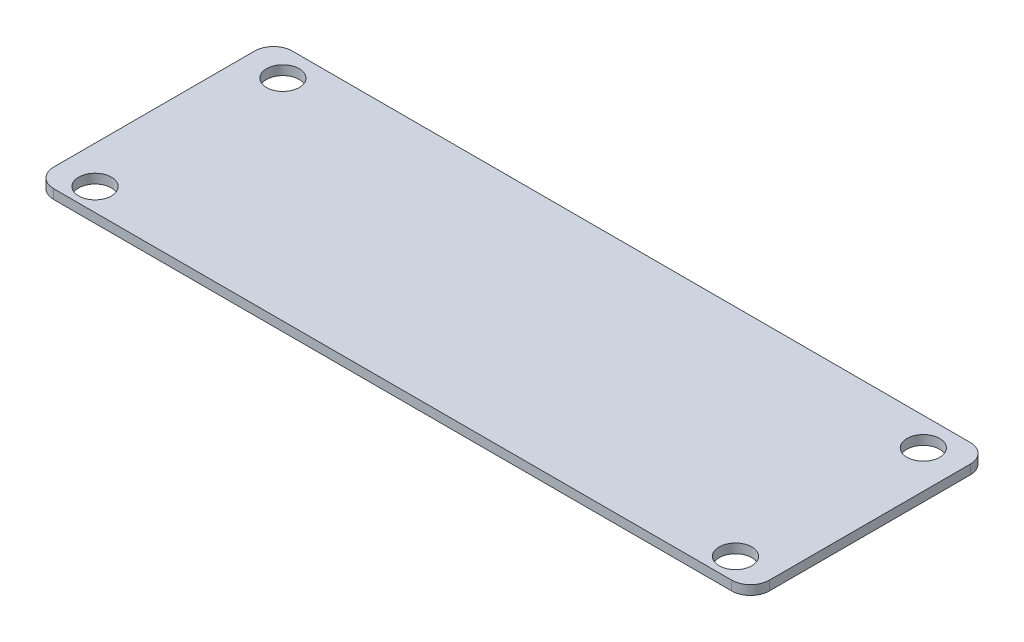
ISO-10303-21;
HEADER;
FILE_DESCRIPTION(('STEP AP214'),'2;1');
FILE_NAME('part.step','',(''),(''),'','','');
FILE_SCHEMA(('AUTOMOTIVE_DESIGN { 1 0 10303 214 1 1 1 1 }'));
ENDSEC;
DATA;
#1=APPLICATION_CONTEXT('core data for automotive mechanical design processes');
#2=APPLICATION_PROTOCOL_DEFINITION('international standard','automotive_design',2000,#1);
#3=PRODUCT_CONTEXT('',#1,'mechanical');
#4=PRODUCT('Part','Part','',(#3));
#5=PRODUCT_RELATED_PRODUCT_CATEGORY('part','',(#4));
#6=PRODUCT_DEFINITION_FORMATION('','',#4);
#7=PRODUCT_DEFINITION_CONTEXT('part definition',#1,'design');
#8=PRODUCT_DEFINITION('design','',#6,#7);
#9=PRODUCT_DEFINITION_SHAPE('','',#8);
#10=(LENGTH_UNIT() NAMED_UNIT(*) SI_UNIT(.MILLI.,.METRE.));
#11=(NAMED_UNIT(*) PLANE_ANGLE_UNIT() SI_UNIT($,.RADIAN.));
#12=(NAMED_UNIT(*) SI_UNIT($,.STERADIAN.) SOLID_ANGLE_UNIT());
#13=UNCERTAINTY_MEASURE_WITH_UNIT(LENGTH_MEASURE(1.E-05),#10,'distance_accuracy_value','');
#14=(GEOMETRIC_REPRESENTATION_CONTEXT(3) GLOBAL_UNCERTAINTY_ASSIGNED_CONTEXT((#13)) GLOBAL_UNIT_ASSIGNED_CONTEXT((#10,
#11,#12)) REPRESENTATION_CONTEXT('',''));
#15=CARTESIAN_POINT('',(0.,0.,0.));
#16=DIRECTION('',(0.,0.,1.));
#17=DIRECTION('',(1.,0.,0.));
#18=AXIS2_PLACEMENT_3D('',#15,#16,#17);
#19=CARTESIAN_POINT('',(36.1,1.,-10.7));
#20=DIRECTION('',(0.,-1.,0.));
#21=DIRECTION('',(0.,0.,-1.));
#22=AXIS2_PLACEMENT_3D('',#19,#20,#21);
#23=PLANE('',#22);
#24=CARTESIAN_POINT('',(36.1,1.,-10.7));
#25=DIRECTION('',(0.,1.,0.));
#26=DIRECTION('',(0.,0.,-1.));
#27=AXIS2_PLACEMENT_3D('',#24,#25,#26);
#28=CIRCLE('',#27,2.);
#29=CARTESIAN_POINT('',(38.1,1.,-10.7));
#30=VERTEX_POINT('',#29);
#31=CARTESIAN_POINT('',(36.1,1.,-12.7));
#32=VERTEX_POINT('',#31);
#33=EDGE_CURVE('E150',#30,#32,#28,.T.);
#34=ORIENTED_EDGE('',*,*,#33,.T.);
#35=DIRECTION('',(-1.,0.,0.));
#36=VECTOR('',#35,1.);
#37=CARTESIAN_POINT('',(-36.1,1.,-12.7));
#38=LINE('',#37,#36);
#39=CARTESIAN_POINT('',(-36.1,1.,-12.7));
#40=VERTEX_POINT('',#39);
#41=EDGE_CURVE('E98',#32,#40,#38,.T.);
#42=ORIENTED_EDGE('',*,*,#41,.T.);
#43=CARTESIAN_POINT('',(-36.1,1.,-10.7));
#44=DIRECTION('',(0.,1.,0.));
#45=DIRECTION('',(0.,0.,-1.));
#46=AXIS2_PLACEMENT_3D('',#43,#44,#45);
#47=CIRCLE('',#46,2.);
#48=CARTESIAN_POINT('',(-38.1,1.,-10.7));
#49=VERTEX_POINT('',#48);
#50=EDGE_CURVE('E165',#40,#49,#47,.T.);
#51=ORIENTED_EDGE('',*,*,#50,.T.);
#52=DIRECTION('',(0.,0.,1.));
#53=VECTOR('',#52,1.);
#54=CARTESIAN_POINT('',(-38.1,1.,10.7));
#55=LINE('',#54,#53);
#56=CARTESIAN_POINT('',(-38.1,1.,10.7));
#57=VERTEX_POINT('',#56);
#58=EDGE_CURVE('E178',#49,#57,#55,.T.);
#59=ORIENTED_EDGE('',*,*,#58,.T.);
#60=CARTESIAN_POINT('',(-36.1,1.,10.7));
#61=DIRECTION('',(0.,1.,0.));
#62=DIRECTION('',(0.,0.,-1.));
#63=AXIS2_PLACEMENT_3D('',#60,#61,#62);
#64=CIRCLE('',#63,2.);
#65=CARTESIAN_POINT('',(-36.1,1.,12.7));
#66=VERTEX_POINT('',#65);
#67=EDGE_CURVE('E117',#57,#66,#64,.T.);
#68=ORIENTED_EDGE('',*,*,#67,.T.);
#69=DIRECTION('',(1.,0.,0.));
#70=VECTOR('',#69,1.);
#71=CARTESIAN_POINT('',(-36.1,1.,12.7));
#72=LINE('',#71,#70);
#73=CARTESIAN_POINT('',(36.1,1.,12.7));
#74=VERTEX_POINT('',#73);
#75=EDGE_CURVE('E111',#66,#74,#72,.T.);
#76=ORIENTED_EDGE('',*,*,#75,.T.);
#77=CARTESIAN_POINT('',(36.1,1.,10.7));
#78=DIRECTION('',(0.,1.,0.));
#79=DIRECTION('',(0.,0.,1.));
#80=AXIS2_PLACEMENT_3D('',#77,#78,#79);
#81=CIRCLE('',#80,2.);
#82=CARTESIAN_POINT('',(38.1,1.,10.7));
#83=VERTEX_POINT('',#82);
#84=EDGE_CURVE('E115',#74,#83,#81,.T.);
#85=ORIENTED_EDGE('',*,*,#84,.T.);
#86=DIRECTION('',(0.,0.,-1.));
#87=VECTOR('',#86,1.);
#88=CARTESIAN_POINT('',(38.1,1.,10.7));
#89=LINE('',#88,#87);
#90=EDGE_CURVE('E55',#83,#30,#89,.T.);
#91=ORIENTED_EDGE('',*,*,#90,.T.);
#92=EDGE_LOOP('',(#34,#42,#51,#59,#68,#76,#85,#91));
#93=FACE_BOUND('',#92,.T.);
#94=CARTESIAN_POINT('',(-34.1,1.,-9.7));
#95=DIRECTION('',(0.,1.,0.));
#96=DIRECTION('',(0.,0.,1.));
#97=AXIS2_PLACEMENT_3D('',#94,#95,#96);
#98=CIRCLE('',#97,1.7399);
#99=CARTESIAN_POINT('',(-34.1,1.,-7.9601));
#100=VERTEX_POINT('',#99);
#101=EDGE_CURVE('E139',#100,#100,#98,.T.);
#102=ORIENTED_EDGE('',*,*,#101,.F.);
#103=EDGE_LOOP('',(#102));
#104=FACE_BOUND('',#103,.T.);
#105=CARTESIAN_POINT('',(-34.1,1.,10.3));
#106=DIRECTION('',(0.,1.,0.));
#107=DIRECTION('',(0.,0.,1.));
#108=AXIS2_PLACEMENT_3D('',#105,#106,#107);
#109=CIRCLE('',#108,1.7399);
#110=CARTESIAN_POINT('',(-34.1,1.,12.0399));
#111=VERTEX_POINT('',#110);
#112=EDGE_CURVE('E187',#111,#111,#109,.T.);
#113=ORIENTED_EDGE('',*,*,#112,.F.);
#114=EDGE_LOOP('',(#113));
#115=FACE_BOUND('',#114,.T.);
#116=CARTESIAN_POINT('',(34.1,1.,10.3));
#117=DIRECTION('',(0.,1.,0.));
#118=DIRECTION('',(0.,0.,-1.));
#119=AXIS2_PLACEMENT_3D('',#116,#117,#118);
#120=CIRCLE('',#119,1.7399);
#121=CARTESIAN_POINT('',(34.1,1.,8.56009999999999));
#122=VERTEX_POINT('',#121);
#123=EDGE_CURVE('E193',#122,#122,#120,.T.);
#124=ORIENTED_EDGE('',*,*,#123,.F.);
#125=EDGE_LOOP('',(#124));
#126=FACE_BOUND('',#125,.T.);
#127=CARTESIAN_POINT('',(34.1,1.,-9.7));
#128=DIRECTION('',(0.,1.,0.));
#129=DIRECTION('',(0.,0.,-1.));
#130=AXIS2_PLACEMENT_3D('',#127,#128,#129);
#131=CIRCLE('',#130,1.7399);
#132=CARTESIAN_POINT('',(34.1,1.,-11.4399));
#133=VERTEX_POINT('',#132);
#134=EDGE_CURVE('E199',#133,#133,#131,.T.);
#135=ORIENTED_EDGE('',*,*,#134,.F.);
#136=EDGE_LOOP('',(#135));
#137=FACE_BOUND('',#136,.T.);
#138=ADVANCED_FACE('F38',(#93,#104,#115,#126,#137),#23,.F.);
#139=CARTESIAN_POINT('',(36.1,0.,-10.7));
#140=DIRECTION('',(0.,-1.,0.));
#141=DIRECTION('',(0.,0.,-1.));
#142=AXIS2_PLACEMENT_3D('',#139,#140,#141);
#143=PLANE('',#142);
#144=CARTESIAN_POINT('',(34.1,0.,10.3));
#145=DIRECTION('',(0.,1.,0.));
#146=DIRECTION('',(0.,0.,-1.));
#147=AXIS2_PLACEMENT_3D('',#144,#145,#146);
#148=CIRCLE('',#147,1.7399);
#149=CARTESIAN_POINT('',(34.1,0.,8.56009999999999));
#150=VERTEX_POINT('',#149);
#151=EDGE_CURVE('E196',#150,#150,#148,.T.);
#152=ORIENTED_EDGE('',*,*,#151,.T.);
#153=EDGE_LOOP('',(#152));
#154=FACE_BOUND('',#153,.T.);
#155=CARTESIAN_POINT('',(-34.1,0.,-9.7));
#156=DIRECTION('',(0.,1.,0.));
#157=DIRECTION('',(0.,0.,1.));
#158=AXIS2_PLACEMENT_3D('',#155,#156,#157);
#159=CIRCLE('',#158,1.7399);
#160=CARTESIAN_POINT('',(-34.1,0.,-7.9601));
#161=VERTEX_POINT('',#160);
#162=EDGE_CURVE('E184',#161,#161,#159,.T.);
#163=ORIENTED_EDGE('',*,*,#162,.T.);
#164=EDGE_LOOP('',(#163));
#165=FACE_BOUND('',#164,.T.);
#166=CARTESIAN_POINT('',(36.1,0.,-10.7));
#167=DIRECTION('',(0.,1.,0.));
#168=DIRECTION('',(0.,0.,-1.));
#169=AXIS2_PLACEMENT_3D('',#166,#167,#168);
#170=CIRCLE('',#169,2.);
#171=CARTESIAN_POINT('',(38.1,0.,-10.7));
#172=VERTEX_POINT('',#171);
#173=CARTESIAN_POINT('',(36.1,0.,-12.7));
#174=VERTEX_POINT('',#173);
#175=EDGE_CURVE('E135',#172,#174,#170,.T.);
#176=ORIENTED_EDGE('',*,*,#175,.F.);
#177=DIRECTION('',(0.,0.,-1.));
#178=VECTOR('',#177,1.);
#179=CARTESIAN_POINT('',(38.1,0.,10.7));
#180=LINE('',#179,#178);
#181=CARTESIAN_POINT('',(38.1,0.,10.7));
#182=VERTEX_POINT('',#181);
#183=EDGE_CURVE('E90',#182,#172,#180,.T.);
#184=ORIENTED_EDGE('',*,*,#183,.F.);
#185=CARTESIAN_POINT('',(36.1,0.,10.7));
#186=DIRECTION('',(0.,1.,0.));
#187=DIRECTION('',(0.,0.,1.));
#188=AXIS2_PLACEMENT_3D('',#185,#186,#187);
#189=CIRCLE('',#188,2.);
#190=CARTESIAN_POINT('',(36.1,0.,12.7));
#191=VERTEX_POINT('',#190);
#192=EDGE_CURVE('E84',#191,#182,#189,.T.);
#193=ORIENTED_EDGE('',*,*,#192,.F.);
#194=DIRECTION('',(1.,0.,0.));
#195=VECTOR('',#194,1.);
#196=CARTESIAN_POINT('',(-36.1,0.,12.7));
#197=LINE('',#196,#195);
#198=CARTESIAN_POINT('',(-36.1,0.,12.7));
#199=VERTEX_POINT('',#198);
#200=EDGE_CURVE('E125',#199,#191,#197,.T.);
#201=ORIENTED_EDGE('',*,*,#200,.F.);
#202=CARTESIAN_POINT('',(-36.1,0.,10.7));
#203=DIRECTION('',(0.,1.,0.));
#204=DIRECTION('',(0.,0.,-1.));
#205=AXIS2_PLACEMENT_3D('',#202,#203,#204);
#206=CIRCLE('',#205,2.);
#207=CARTESIAN_POINT('',(-38.1,0.,10.7));
#208=VERTEX_POINT('',#207);
#209=EDGE_CURVE('E145',#208,#199,#206,.T.);
#210=ORIENTED_EDGE('',*,*,#209,.F.);
#211=DIRECTION('',(0.,0.,1.));
#212=VECTOR('',#211,1.);
#213=CARTESIAN_POINT('',(-38.1,0.,10.7));
#214=LINE('',#213,#212);
#215=CARTESIAN_POINT('',(-38.1,0.,-10.7));
#216=VERTEX_POINT('',#215);
#217=EDGE_CURVE('E143',#216,#208,#214,.T.);
#218=ORIENTED_EDGE('',*,*,#217,.F.);
#219=CARTESIAN_POINT('',(-36.1,0.,-10.7));
#220=DIRECTION('',(0.,1.,0.));
#221=DIRECTION('',(0.,0.,-1.));
#222=AXIS2_PLACEMENT_3D('',#219,#220,#221);
#223=CIRCLE('',#222,2.);
#224=CARTESIAN_POINT('',(-36.1,0.,-12.7));
#225=VERTEX_POINT('',#224);
#226=EDGE_CURVE('E141',#225,#216,#223,.T.);
#227=ORIENTED_EDGE('',*,*,#226,.F.);
#228=DIRECTION('',(-1.,0.,0.));
#229=VECTOR('',#228,1.);
#230=CARTESIAN_POINT('',(-36.1,0.,-12.7));
#231=LINE('',#230,#229);
#232=EDGE_CURVE('E138',#174,#225,#231,.T.);
#233=ORIENTED_EDGE('',*,*,#232,.F.);
#234=EDGE_LOOP('',(#176,#184,#193,#201,#210,#218,#227,#233));
#235=FACE_BOUND('',#234,.T.);
#236=CARTESIAN_POINT('',(-34.1,0.,10.3));
#237=DIRECTION('',(0.,1.,0.));
#238=DIRECTION('',(0.,0.,1.));
#239=AXIS2_PLACEMENT_3D('',#236,#237,#238);
#240=CIRCLE('',#239,1.7399);
#241=CARTESIAN_POINT('',(-34.1,0.,12.0399));
#242=VERTEX_POINT('',#241);
#243=EDGE_CURVE('E190',#242,#242,#240,.T.);
#244=ORIENTED_EDGE('',*,*,#243,.T.);
#245=EDGE_LOOP('',(#244));
#246=FACE_BOUND('',#245,.T.);
#247=CARTESIAN_POINT('',(34.1,0.,-9.7));
#248=DIRECTION('',(0.,1.,0.));
#249=DIRECTION('',(0.,0.,-1.));
#250=AXIS2_PLACEMENT_3D('',#247,#248,#249);
#251=CIRCLE('',#250,1.7399);
#252=CARTESIAN_POINT('',(34.1,0.,-11.4399));
#253=VERTEX_POINT('',#252);
#254=EDGE_CURVE('E202',#253,#253,#251,.T.);
#255=ORIENTED_EDGE('',*,*,#254,.T.);
#256=EDGE_LOOP('',(#255));
#257=FACE_BOUND('',#256,.T.);
#258=ADVANCED_FACE('F169',(#154,#165,#235,#246,#257),#143,.T.);
#259=CARTESIAN_POINT('',(36.1,1.,-10.7));
#260=DIRECTION('',(0.,-1.,0.));
#261=DIRECTION('',(0.,0.,-1.));
#262=AXIS2_PLACEMENT_3D('',#259,#260,#261);
#263=CYLINDRICAL_SURFACE('',#262,2.);
#264=ORIENTED_EDGE('',*,*,#175,.T.);
#265=DIRECTION('',(0.,-1.,0.));
#266=VECTOR('',#265,1.);
#267=CARTESIAN_POINT('',(36.1,1.,-12.7));
#268=LINE('',#267,#266);
#269=EDGE_CURVE('E11',#32,#174,#268,.T.);
#270=ORIENTED_EDGE('',*,*,#269,.F.);
#271=ORIENTED_EDGE('',*,*,#33,.F.);
#272=DIRECTION('',(0.,-1.,0.));
#273=VECTOR('',#272,1.);
#274=CARTESIAN_POINT('',(38.1,1.,-10.7));
#275=LINE('',#274,#273);
#276=EDGE_CURVE('E131',#30,#172,#275,.T.);
#277=ORIENTED_EDGE('',*,*,#276,.T.);
#278=EDGE_LOOP('',(#264,#270,#271,#277));
#279=FACE_BOUND('',#278,.T.);
#280=ADVANCED_FACE('F40',(#279),#263,.T.);
#281=CARTESIAN_POINT('',(-36.1,1.,-12.7));
#282=DIRECTION('',(0.,0.,1.));
#283=DIRECTION('',(1.,0.,0.));
#284=AXIS2_PLACEMENT_3D('',#281,#282,#283);
#285=PLANE('',#284);
#286=ORIENTED_EDGE('',*,*,#232,.T.);
#287=DIRECTION('',(0.,-1.,0.));
#288=VECTOR('',#287,1.);
#289=CARTESIAN_POINT('',(-36.1,1.,-12.7));
#290=LINE('',#289,#288);
#291=EDGE_CURVE('E47',#40,#225,#290,.T.);
#292=ORIENTED_EDGE('',*,*,#291,.F.);
#293=ORIENTED_EDGE('',*,*,#41,.F.);
#294=ORIENTED_EDGE('',*,*,#269,.T.);
#295=EDGE_LOOP('',(#286,#292,#293,#294));
#296=FACE_BOUND('',#295,.T.);
#297=ADVANCED_FACE('F234',(#296),#285,.F.);
#298=CARTESIAN_POINT('',(-36.1,1.,-10.7));
#299=DIRECTION('',(0.,-1.,0.));
#300=DIRECTION('',(0.,0.,-1.));
#301=AXIS2_PLACEMENT_3D('',#298,#299,#300);
#302=CYLINDRICAL_SURFACE('',#301,2.);
#303=ORIENTED_EDGE('',*,*,#226,.T.);
#304=DIRECTION('',(0.,-1.,0.));
#305=VECTOR('',#304,1.);
#306=CARTESIAN_POINT('',(-38.1,1.,-10.7));
#307=LINE('',#306,#305);
#308=EDGE_CURVE('E157',#49,#216,#307,.T.);
#309=ORIENTED_EDGE('',*,*,#308,.F.);
#310=ORIENTED_EDGE('',*,*,#50,.F.);
#311=ORIENTED_EDGE('',*,*,#291,.T.);
#312=EDGE_LOOP('',(#303,#309,#310,#311));
#313=FACE_BOUND('',#312,.T.);
#314=ADVANCED_FACE('F163',(#313),#302,.T.);
#315=CARTESIAN_POINT('',(-38.1,1.,10.7));
#316=DIRECTION('',(1.,0.,0.));
#317=DIRECTION('',(0.,0.,-1.));
#318=AXIS2_PLACEMENT_3D('',#315,#316,#317);
#319=PLANE('',#318);
#320=ORIENTED_EDGE('',*,*,#217,.T.);
#321=DIRECTION('',(0.,-1.,0.));
#322=VECTOR('',#321,1.);
#323=CARTESIAN_POINT('',(-38.1,1.,10.7));
#324=LINE('',#323,#322);
#325=EDGE_CURVE('E154',#57,#208,#324,.T.);
#326=ORIENTED_EDGE('',*,*,#325,.F.);
#327=ORIENTED_EDGE('',*,*,#58,.F.);
#328=ORIENTED_EDGE('',*,*,#308,.T.);
#329=EDGE_LOOP('',(#320,#326,#327,#328));
#330=FACE_BOUND('',#329,.T.);
#331=ADVANCED_FACE('F174',(#330),#319,.F.);
#332=CARTESIAN_POINT('',(-36.1,1.,10.7));
#333=DIRECTION('',(0.,-1.,0.));
#334=DIRECTION('',(0.,0.,-1.));
#335=AXIS2_PLACEMENT_3D('',#332,#333,#334);
#336=CYLINDRICAL_SURFACE('',#335,2.);
#337=ORIENTED_EDGE('',*,*,#209,.T.);
#338=DIRECTION('',(0.,-1.,0.));
#339=VECTOR('',#338,1.);
#340=CARTESIAN_POINT('',(-36.1,1.,12.7));
#341=LINE('',#340,#339);
#342=EDGE_CURVE('E126',#66,#199,#341,.T.);
#343=ORIENTED_EDGE('',*,*,#342,.F.);
#344=ORIENTED_EDGE('',*,*,#67,.F.);
#345=ORIENTED_EDGE('',*,*,#325,.T.);
#346=EDGE_LOOP('',(#337,#343,#344,#345));
#347=FACE_BOUND('',#346,.T.);
#348=ADVANCED_FACE('F177',(#347),#336,.T.);
#349=CARTESIAN_POINT('',(-36.1,1.,12.7));
#350=DIRECTION('',(0.,0.,-1.));
#351=DIRECTION('',(-1.,0.,0.));
#352=AXIS2_PLACEMENT_3D('',#349,#350,#351);
#353=PLANE('',#352);
#354=ORIENTED_EDGE('',*,*,#200,.T.);
#355=DIRECTION('',(0.,-1.,0.));
#356=VECTOR('',#355,1.);
#357=CARTESIAN_POINT('',(36.1,1.,12.7));
#358=LINE('',#357,#356);
#359=EDGE_CURVE('E122',#74,#191,#358,.T.);
#360=ORIENTED_EDGE('',*,*,#359,.F.);
#361=ORIENTED_EDGE('',*,*,#75,.F.);
#362=ORIENTED_EDGE('',*,*,#342,.T.);
#363=EDGE_LOOP('',(#354,#360,#361,#362));
#364=FACE_BOUND('',#363,.T.);
#365=ADVANCED_FACE('F123',(#364),#353,.F.);
#366=CARTESIAN_POINT('',(36.1,1.,10.7));
#367=DIRECTION('',(0.,-1.,0.));
#368=DIRECTION('',(0.,0.,-1.));
#369=AXIS2_PLACEMENT_3D('',#366,#367,#368);
#370=CYLINDRICAL_SURFACE('',#369,2.);
#371=ORIENTED_EDGE('',*,*,#192,.T.);
#372=DIRECTION('',(0.,-1.,0.));
#373=VECTOR('',#372,1.);
#374=CARTESIAN_POINT('',(38.1,1.,10.7));
#375=LINE('',#374,#373);
#376=EDGE_CURVE('E127',#83,#182,#375,.T.);
#377=ORIENTED_EDGE('',*,*,#376,.F.);
#378=ORIENTED_EDGE('',*,*,#84,.F.);
#379=ORIENTED_EDGE('',*,*,#359,.T.);
#380=EDGE_LOOP('',(#371,#377,#378,#379));
#381=FACE_BOUND('',#380,.T.);
#382=ADVANCED_FACE('F129',(#381),#370,.T.);
#383=CARTESIAN_POINT('',(38.1,1.,10.7));
#384=DIRECTION('',(-1.,0.,0.));
#385=DIRECTION('',(0.,0.,1.));
#386=AXIS2_PLACEMENT_3D('',#383,#384,#385);
#387=PLANE('',#386);
#388=ORIENTED_EDGE('',*,*,#183,.T.);
#389=ORIENTED_EDGE('',*,*,#276,.F.);
#390=ORIENTED_EDGE('',*,*,#90,.F.);
#391=ORIENTED_EDGE('',*,*,#376,.T.);
#392=EDGE_LOOP('',(#388,#389,#390,#391));
#393=FACE_BOUND('',#392,.T.);
#394=ADVANCED_FACE('F222',(#393),#387,.F.);
#395=CARTESIAN_POINT('',(-34.1,1.,-9.7));
#396=DIRECTION('',(0.,-1.,0.));
#397=DIRECTION('',(0.,0.,-1.));
#398=AXIS2_PLACEMENT_3D('',#395,#396,#397);
#399=CYLINDRICAL_SURFACE('',#398,1.7399);
#400=ORIENTED_EDGE('',*,*,#101,.T.);
#401=EDGE_LOOP('',(#400));
#402=FACE_BOUND('',#401,.T.);
#403=ORIENTED_EDGE('',*,*,#162,.F.);
#404=EDGE_LOOP('',(#403));
#405=FACE_BOUND('',#404,.T.);
#406=ADVANCED_FACE('F219',(#402,#405),#399,.F.);
#407=CARTESIAN_POINT('',(-34.1,1.,10.3));
#408=DIRECTION('',(0.,-1.,0.));
#409=DIRECTION('',(0.,0.,-1.));
#410=AXIS2_PLACEMENT_3D('',#407,#408,#409);
#411=CYLINDRICAL_SURFACE('',#410,1.7399);
#412=ORIENTED_EDGE('',*,*,#112,.T.);
#413=EDGE_LOOP('',(#412));
#414=FACE_BOUND('',#413,.T.);
#415=ORIENTED_EDGE('',*,*,#243,.F.);
#416=EDGE_LOOP('',(#415));
#417=FACE_BOUND('',#416,.T.);
#418=ADVANCED_FACE('F297',(#414,#417),#411,.F.);
#419=CARTESIAN_POINT('',(34.1,1.,10.3));
#420=DIRECTION('',(0.,-1.,0.));
#421=DIRECTION('',(0.,0.,-1.));
#422=AXIS2_PLACEMENT_3D('',#419,#420,#421);
#423=CYLINDRICAL_SURFACE('',#422,1.7399);
#424=ORIENTED_EDGE('',*,*,#123,.T.);
#425=EDGE_LOOP('',(#424));
#426=FACE_BOUND('',#425,.T.);
#427=ORIENTED_EDGE('',*,*,#151,.F.);
#428=EDGE_LOOP('',(#427));
#429=FACE_BOUND('',#428,.T.);
#430=ADVANCED_FACE('F305',(#426,#429),#423,.F.);
#431=CARTESIAN_POINT('',(34.1,1.,-9.7));
#432=DIRECTION('',(0.,-1.,0.));
#433=DIRECTION('',(0.,0.,-1.));
#434=AXIS2_PLACEMENT_3D('',#431,#432,#433);
#435=CYLINDRICAL_SURFACE('',#434,1.7399);
#436=ORIENTED_EDGE('',*,*,#134,.T.);
#437=EDGE_LOOP('',(#436));
#438=FACE_BOUND('',#437,.T.);
#439=ORIENTED_EDGE('',*,*,#254,.F.);
#440=EDGE_LOOP('',(#439));
#441=FACE_BOUND('',#440,.T.);
#442=ADVANCED_FACE('F208',(#438,#441),#435,.F.);
#443=CLOSED_SHELL('',(#138,#258,#280,#297,#314,#331,#348,#365,#382,#394,#406,#418,#430,#442));
#444=MANIFOLD_SOLID_BREP('B2',#443);
#445=ADVANCED_BREP_SHAPE_REPRESENTATION('',(#18,#444),#14);
#446=SHAPE_DEFINITION_REPRESENTATION(#9,#445);
ENDSEC;
END-ISO-10303-21;
